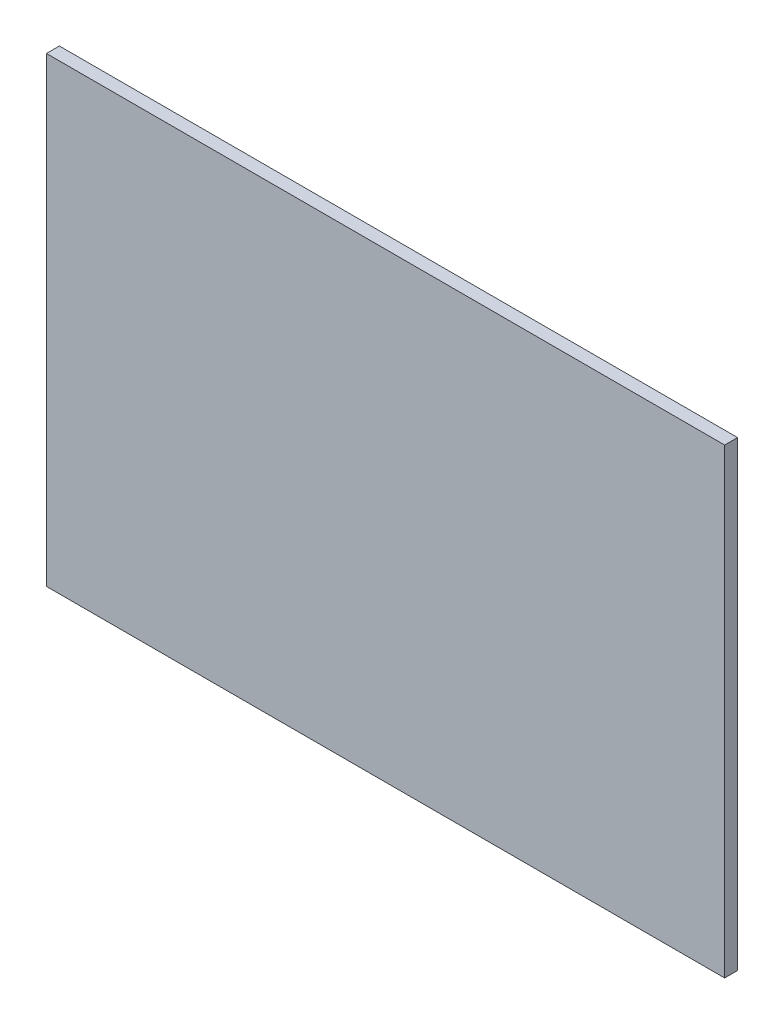
ISO-10303-21;
HEADER;
FILE_DESCRIPTION(('STEP AP214'),'2;1');
FILE_NAME('part.step','',(''),(''),'','','');
FILE_SCHEMA(('AUTOMOTIVE_DESIGN { 1 0 10303 214 1 1 1 1 }'));
ENDSEC;
DATA;
#1=APPLICATION_CONTEXT('core data for automotive mechanical design processes');
#2=APPLICATION_PROTOCOL_DEFINITION('international standard','automotive_design',2000,#1);
#3=PRODUCT_CONTEXT('',#1,'mechanical');
#4=PRODUCT('Part','Part','',(#3));
#5=PRODUCT_RELATED_PRODUCT_CATEGORY('part','',(#4));
#6=PRODUCT_DEFINITION_FORMATION('','',#4);
#7=PRODUCT_DEFINITION_CONTEXT('part definition',#1,'design');
#8=PRODUCT_DEFINITION('design','',#6,#7);
#9=PRODUCT_DEFINITION_SHAPE('','',#8);
#10=(LENGTH_UNIT() NAMED_UNIT(*) SI_UNIT(.MILLI.,.METRE.));
#11=(NAMED_UNIT(*) PLANE_ANGLE_UNIT() SI_UNIT($,.RADIAN.));
#12=(NAMED_UNIT(*) SI_UNIT($,.STERADIAN.) SOLID_ANGLE_UNIT());
#13=UNCERTAINTY_MEASURE_WITH_UNIT(LENGTH_MEASURE(1.E-05),#10,'distance_accuracy_value','');
#14=(GEOMETRIC_REPRESENTATION_CONTEXT(3) GLOBAL_UNCERTAINTY_ASSIGNED_CONTEXT((#13)) GLOBAL_UNIT_ASSIGNED_CONTEXT((#10,
#11,#12)) REPRESENTATION_CONTEXT('',''));
#15=CARTESIAN_POINT('',(0.,0.,0.));
#16=DIRECTION('',(0.,0.,1.));
#17=DIRECTION('',(1.,0.,0.));
#18=AXIS2_PLACEMENT_3D('',#15,#16,#17);
#19=CARTESIAN_POINT('',(-670.,713.3,19.05));
#20=DIRECTION('',(1.,0.,0.));
#21=DIRECTION('',(0.,1.,0.));
#22=AXIS2_PLACEMENT_3D('',#19,#20,#21);
#23=PLANE('',#22);
#24=DIRECTION('',(0.,-1.,0.));
#25=VECTOR('',#24,1.);
#26=CARTESIAN_POINT('',(-670.,713.3,0.));
#27=LINE('',#26,#25);
#28=CARTESIAN_POINT('',(-670.,713.3,0.));
#29=VERTEX_POINT('',#28);
#30=CARTESIAN_POINT('',(-670.,32.7000000000002,0.));
#31=VERTEX_POINT('',#30);
#32=EDGE_CURVE('E96',#29,#31,#27,.T.);
#33=ORIENTED_EDGE('',*,*,#32,.T.);
#34=DIRECTION('',(0.,0.,-1.));
#35=VECTOR('',#34,1.);
#36=CARTESIAN_POINT('',(-670.,32.7000000000002,19.05));
#37=LINE('',#36,#35);
#38=CARTESIAN_POINT('',(-670.,32.7000000000002,19.05));
#39=VERTEX_POINT('',#38);
#40=EDGE_CURVE('E11',#39,#31,#37,.T.);
#41=ORIENTED_EDGE('',*,*,#40,.F.);
#42=DIRECTION('',(0.,-1.,0.));
#43=VECTOR('',#42,1.);
#44=CARTESIAN_POINT('',(-670.,713.3,19.05));
#45=LINE('',#44,#43);
#46=CARTESIAN_POINT('',(-670.,713.3,19.05));
#47=VERTEX_POINT('',#46);
#48=EDGE_CURVE('E84',#47,#39,#45,.T.);
#49=ORIENTED_EDGE('',*,*,#48,.F.);
#50=DIRECTION('',(0.,0.,-1.));
#51=VECTOR('',#50,1.);
#52=CARTESIAN_POINT('',(-670.,713.3,19.05));
#53=LINE('',#52,#51);
#54=EDGE_CURVE('E92',#47,#29,#53,.T.);
#55=ORIENTED_EDGE('',*,*,#54,.T.);
#56=EDGE_LOOP('',(#33,#41,#49,#55));
#57=FACE_BOUND('',#56,.T.);
#58=ADVANCED_FACE('F33',(#57),#23,.F.);
#59=CARTESIAN_POINT('',(-670.,32.7000000000002,19.05));
#60=DIRECTION('',(0.,1.,0.));
#61=DIRECTION('',(0.,0.,1.));
#62=AXIS2_PLACEMENT_3D('',#59,#60,#61);
#63=PLANE('',#62);
#64=DIRECTION('',(1.,0.,0.));
#65=VECTOR('',#64,1.);
#66=CARTESIAN_POINT('',(-670.,32.7000000000002,0.));
#67=LINE('',#66,#65);
#68=CARTESIAN_POINT('',(330.,32.7000000000002,0.));
#69=VERTEX_POINT('',#68);
#70=EDGE_CURVE('E88',#31,#69,#67,.T.);
#71=ORIENTED_EDGE('',*,*,#70,.T.);
#72=DIRECTION('',(0.,0.,-1.));
#73=VECTOR('',#72,1.);
#74=CARTESIAN_POINT('',(330.,32.7000000000002,19.05));
#75=LINE('',#74,#73);
#76=CARTESIAN_POINT('',(330.,32.7000000000002,19.05));
#77=VERTEX_POINT('',#76);
#78=EDGE_CURVE('E41',#77,#69,#75,.T.);
#79=ORIENTED_EDGE('',*,*,#78,.F.);
#80=DIRECTION('',(1.,0.,0.));
#81=VECTOR('',#80,1.);
#82=CARTESIAN_POINT('',(-670.,32.7000000000002,19.05));
#83=LINE('',#82,#81);
#84=EDGE_CURVE('E79',#39,#77,#83,.T.);
#85=ORIENTED_EDGE('',*,*,#84,.F.);
#86=ORIENTED_EDGE('',*,*,#40,.T.);
#87=EDGE_LOOP('',(#71,#79,#85,#86));
#88=FACE_BOUND('',#87,.T.);
#89=ADVANCED_FACE('F87',(#88),#63,.F.);
#90=CARTESIAN_POINT('',(330.,713.3,19.05));
#91=DIRECTION('',(-1.,0.,0.));
#92=DIRECTION('',(0.,-1.,0.));
#93=AXIS2_PLACEMENT_3D('',#90,#91,#92);
#94=PLANE('',#93);
#95=DIRECTION('',(0.,1.,0.));
#96=VECTOR('',#95,1.);
#97=CARTESIAN_POINT('',(330.,713.3,0.));
#98=LINE('',#97,#96);
#99=CARTESIAN_POINT('',(330.,713.3,0.));
#100=VERTEX_POINT('',#99);
#101=EDGE_CURVE('E66',#69,#100,#98,.T.);
#102=ORIENTED_EDGE('',*,*,#101,.T.);
#103=DIRECTION('',(0.,0.,-1.));
#104=VECTOR('',#103,1.);
#105=CARTESIAN_POINT('',(330.,713.3,19.05));
#106=LINE('',#105,#104);
#107=CARTESIAN_POINT('',(330.,713.3,19.05));
#108=VERTEX_POINT('',#107);
#109=EDGE_CURVE('E89',#108,#100,#106,.T.);
#110=ORIENTED_EDGE('',*,*,#109,.F.);
#111=DIRECTION('',(0.,1.,0.));
#112=VECTOR('',#111,1.);
#113=CARTESIAN_POINT('',(330.,713.3,19.05));
#114=LINE('',#113,#112);
#115=EDGE_CURVE('E82',#77,#108,#114,.T.);
#116=ORIENTED_EDGE('',*,*,#115,.F.);
#117=ORIENTED_EDGE('',*,*,#78,.T.);
#118=EDGE_LOOP('',(#102,#110,#116,#117));
#119=FACE_BOUND('',#118,.T.);
#120=ADVANCED_FACE('F90',(#119),#94,.F.);
#121=CARTESIAN_POINT('',(-670.,713.3,19.05));
#122=DIRECTION('',(0.,-1.,0.));
#123=DIRECTION('',(0.,0.,-1.));
#124=AXIS2_PLACEMENT_3D('',#121,#122,#123);
#125=PLANE('',#124);
#126=DIRECTION('',(-1.,0.,0.));
#127=VECTOR('',#126,1.);
#128=CARTESIAN_POINT('',(-670.,713.3,0.));
#129=LINE('',#128,#127);
#130=EDGE_CURVE('E72',#100,#29,#129,.T.);
#131=ORIENTED_EDGE('',*,*,#130,.T.);
#132=ORIENTED_EDGE('',*,*,#54,.F.);
#133=DIRECTION('',(-1.,0.,0.));
#134=VECTOR('',#133,1.);
#135=CARTESIAN_POINT('',(-670.,713.3,19.05));
#136=LINE('',#135,#134);
#137=EDGE_CURVE('E49',#108,#47,#136,.T.);
#138=ORIENTED_EDGE('',*,*,#137,.F.);
#139=ORIENTED_EDGE('',*,*,#109,.T.);
#140=EDGE_LOOP('',(#131,#132,#138,#139));
#141=FACE_BOUND('',#140,.T.);
#142=ADVANCED_FACE('F103',(#141),#125,.F.);
#143=CARTESIAN_POINT('',(0.,0.,19.05));
#144=DIRECTION('',(0.,0.,1.));
#145=DIRECTION('',(1.,0.,0.));
#146=AXIS2_PLACEMENT_3D('',#143,#144,#145);
#147=PLANE('',#146);
#148=ORIENTED_EDGE('',*,*,#48,.T.);
#149=ORIENTED_EDGE('',*,*,#84,.T.);
#150=ORIENTED_EDGE('',*,*,#115,.T.);
#151=ORIENTED_EDGE('',*,*,#137,.T.);
#152=EDGE_LOOP('',(#148,#149,#150,#151));
#153=FACE_BOUND('',#152,.T.);
#154=ADVANCED_FACE('F80',(#153),#147,.T.);
#155=CARTESIAN_POINT('',(0.,0.,0.));
#156=DIRECTION('',(0.,0.,1.));
#157=DIRECTION('',(1.,0.,0.));
#158=AXIS2_PLACEMENT_3D('',#155,#156,#157);
#159=PLANE('',#158);
#160=ORIENTED_EDGE('',*,*,#32,.F.);
#161=ORIENTED_EDGE('',*,*,#130,.F.);
#162=ORIENTED_EDGE('',*,*,#101,.F.);
#163=ORIENTED_EDGE('',*,*,#70,.F.);
#164=EDGE_LOOP('',(#160,#161,#162,#163));
#165=FACE_BOUND('',#164,.T.);
#166=ADVANCED_FACE('F106',(#165),#159,.F.);
#167=CLOSED_SHELL('',(#58,#89,#120,#142,#154,#166));
#168=MANIFOLD_SOLID_BREP('B2',#167);
#169=ADVANCED_BREP_SHAPE_REPRESENTATION('',(#18,#168),#14);
#170=SHAPE_DEFINITION_REPRESENTATION(#9,#169);
ENDSEC;
END-ISO-10303-21;
